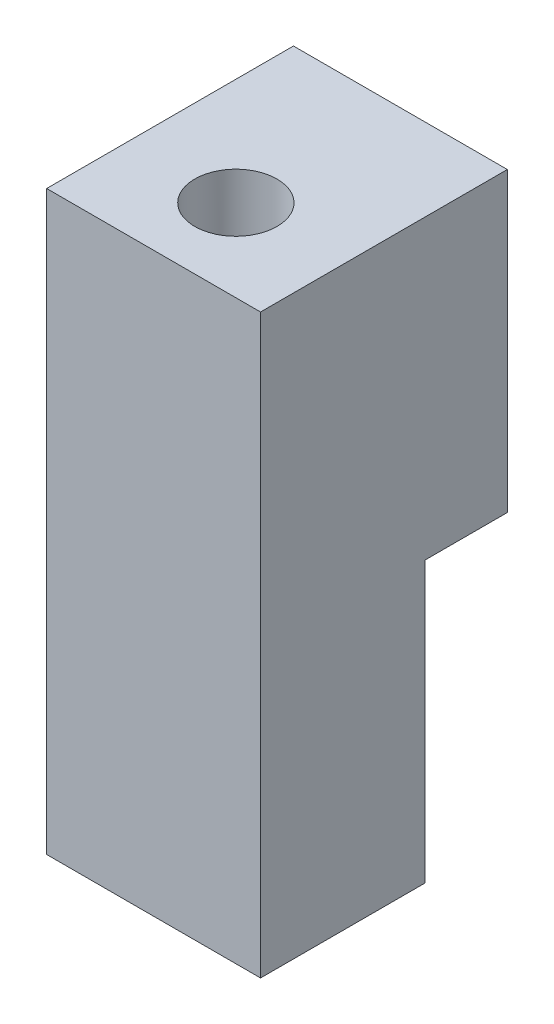
ISO-10303-21;
HEADER;
FILE_DESCRIPTION(('STEP AP214'),'2;1');
FILE_NAME('part.step','',(''),(''),'','','');
FILE_SCHEMA(('AUTOMOTIVE_DESIGN { 1 0 10303 214 1 1 1 1 }'));
ENDSEC;
DATA;
#1=APPLICATION_CONTEXT('core data for automotive mechanical design processes');
#2=APPLICATION_PROTOCOL_DEFINITION('international standard','automotive_design',2000,#1);
#3=PRODUCT_CONTEXT('',#1,'mechanical');
#4=PRODUCT('Part','Part','',(#3));
#5=PRODUCT_RELATED_PRODUCT_CATEGORY('part','',(#4));
#6=PRODUCT_DEFINITION_FORMATION('','',#4);
#7=PRODUCT_DEFINITION_CONTEXT('part definition',#1,'design');
#8=PRODUCT_DEFINITION('design','',#6,#7);
#9=PRODUCT_DEFINITION_SHAPE('','',#8);
#10=(LENGTH_UNIT() NAMED_UNIT(*) SI_UNIT(.MILLI.,.METRE.));
#11=(NAMED_UNIT(*) PLANE_ANGLE_UNIT() SI_UNIT($,.RADIAN.));
#12=(NAMED_UNIT(*) SI_UNIT($,.STERADIAN.) SOLID_ANGLE_UNIT());
#13=UNCERTAINTY_MEASURE_WITH_UNIT(LENGTH_MEASURE(1.E-05),#10,'distance_accuracy_value','');
#14=(GEOMETRIC_REPRESENTATION_CONTEXT(3) GLOBAL_UNCERTAINTY_ASSIGNED_CONTEXT((#13)) GLOBAL_UNIT_ASSIGNED_CONTEXT((#10,
#11,#12)) REPRESENTATION_CONTEXT('',''));
#15=CARTESIAN_POINT('',(0.,0.,0.));
#16=DIRECTION('',(0.,0.,1.));
#17=DIRECTION('',(1.,0.,0.));
#18=AXIS2_PLACEMENT_3D('',#15,#16,#17);
#19=CARTESIAN_POINT('',(125.75,35.,10.));
#20=DIRECTION('',(1.,0.,0.));
#21=DIRECTION('',(0.,0.,-1.));
#22=AXIS2_PLACEMENT_3D('',#19,#20,#21);
#23=PLANE('',#22);
#24=DIRECTION('',(0.,0.,-1.));
#25=VECTOR('',#24,1.);
#26=CARTESIAN_POINT('',(125.75,16.9444271909998,0.));
#27=LINE('',#26,#25);
#28=CARTESIAN_POINT('',(125.75,16.9444271909998,5.));
#29=VERTEX_POINT('',#28);
#30=CARTESIAN_POINT('',(125.75,16.9444271909998,0.));
#31=VERTEX_POINT('',#30);
#32=EDGE_CURVE('E64',#29,#31,#27,.T.);
#33=ORIENTED_EDGE('',*,*,#32,.F.);
#34=DIRECTION('',(0.,1.,0.));
#35=VECTOR('',#34,1.);
#36=CARTESIAN_POINT('',(125.75,-0.0555728090001692,5.));
#37=LINE('',#36,#35);
#38=CARTESIAN_POINT('',(125.75,-0.0555728090001692,5.));
#39=VERTEX_POINT('',#38);
#40=EDGE_CURVE('E291',#39,#29,#37,.T.);
#41=ORIENTED_EDGE('',*,*,#40,.F.);
#42=DIRECTION('',(0.,0.,-1.));
#43=VECTOR('',#42,1.);
#44=CARTESIAN_POINT('',(125.75,-0.0555728090001692,15.));
#45=LINE('',#44,#43);
#46=CARTESIAN_POINT('',(125.75,-0.0555728090001692,15.));
#47=VERTEX_POINT('',#46);
#48=EDGE_CURVE('E323',#47,#39,#45,.T.);
#49=ORIENTED_EDGE('',*,*,#48,.F.);
#50=DIRECTION('',(0.,1.,0.));
#51=VECTOR('',#50,1.);
#52=CARTESIAN_POINT('',(125.75,12.9444271909998,15.));
#53=LINE('',#52,#51);
#54=CARTESIAN_POINT('',(125.75,35.,15.));
#55=VERTEX_POINT('',#54);
#56=EDGE_CURVE('E218',#47,#55,#53,.T.);
#57=ORIENTED_EDGE('',*,*,#56,.T.);
#58=DIRECTION('',(0.,0.,-1.));
#59=VECTOR('',#58,1.);
#60=CARTESIAN_POINT('',(125.75,35.,10.));
#61=LINE('',#60,#59);
#62=CARTESIAN_POINT('',(125.75,35.,0.));
#63=VERTEX_POINT('',#62);
#64=EDGE_CURVE('E57',#55,#63,#61,.T.);
#65=ORIENTED_EDGE('',*,*,#64,.T.);
#66=DIRECTION('',(0.,-1.,0.));
#67=VECTOR('',#66,1.);
#68=CARTESIAN_POINT('',(125.75,35.,0.));
#69=LINE('',#68,#67);
#70=EDGE_CURVE('E211',#63,#31,#69,.T.);
#71=ORIENTED_EDGE('',*,*,#70,.T.);
#72=EDGE_LOOP('',(#33,#41,#49,#57,#65,#71));
#73=FACE_BOUND('',#72,.T.);
#74=ADVANCED_FACE('F49',(#73),#23,.F.);
#75=CARTESIAN_POINT('',(132.25,12.9444271909998,10.));
#76=DIRECTION('',(0.,0.,-1.));
#77=DIRECTION('',(-1.,0.,0.));
#78=AXIS2_PLACEMENT_3D('',#75,#76,#77);
#79=CYLINDRICAL_SURFACE('',#78,6.50000000000001);
#80=DIRECTION('',(0.,0.,-1.));
#81=VECTOR('',#80,1.);
#82=CARTESIAN_POINT('',(127.12652461702,16.9444271909998,10.));
#83=LINE('',#82,#81);
#84=CARTESIAN_POINT('',(127.12652461702,16.9444271909998,0.));
#85=VERTEX_POINT('',#84);
#86=CARTESIAN_POINT('',(127.12652461702,16.9444271909998,5.));
#87=VERTEX_POINT('',#86);
#88=EDGE_CURVE('E339',#85,#87,#83,.F.);
#89=ORIENTED_EDGE('',*,*,#88,.F.);
#90=CARTESIAN_POINT('',(132.25,12.9444271909998,0.));
#91=DIRECTION('',(0.,0.,-1.));
#92=DIRECTION('',(1.,0.,0.));
#93=AXIS2_PLACEMENT_3D('',#90,#91,#92);
#94=CIRCLE('',#93,6.50000000000001);
#95=CARTESIAN_POINT('',(137.37347538298,16.9444271909998,0.));
#96=VERTEX_POINT('',#95);
#97=EDGE_CURVE('E208',#85,#96,#94,.T.);
#98=ORIENTED_EDGE('',*,*,#97,.T.);
#99=DIRECTION('',(0.,0.,-1.));
#100=VECTOR('',#99,1.);
#101=CARTESIAN_POINT('',(137.37347538298,16.9444271909998,10.));
#102=LINE('',#101,#100);
#103=CARTESIAN_POINT('',(137.37347538298,16.9444271909998,5.));
#104=VERTEX_POINT('',#103);
#105=EDGE_CURVE('E71',#104,#96,#102,.T.);
#106=ORIENTED_EDGE('',*,*,#105,.F.);
#107=CARTESIAN_POINT('',(132.25,12.9444271909998,5.));
#108=DIRECTION('',(0.,0.,-1.));
#109=DIRECTION('',(-1.,0.,0.));
#110=AXIS2_PLACEMENT_3D('',#107,#108,#109);
#111=CIRCLE('',#110,6.50000000000001);
#112=EDGE_CURVE('E222',#104,#87,#111,.F.);
#113=ORIENTED_EDGE('',*,*,#112,.T.);
#114=EDGE_LOOP('',(#89,#98,#106,#113));
#115=FACE_BOUND('',#114,.T.);
#116=ADVANCED_FACE('F349',(#115),#79,.F.);
#117=CARTESIAN_POINT('',(138.75,12.9444271909998,10.));
#118=DIRECTION('',(-1.,0.,0.));
#119=DIRECTION('',(0.,0.,1.));
#120=AXIS2_PLACEMENT_3D('',#117,#118,#119);
#121=PLANE('',#120);
#122=DIRECTION('',(0.,1.,0.));
#123=VECTOR('',#122,1.);
#124=CARTESIAN_POINT('',(138.75,-0.0555728090001692,5.));
#125=LINE('',#124,#123);
#126=CARTESIAN_POINT('',(138.75,-0.0555728090001692,5.));
#127=VERTEX_POINT('',#126);
#128=CARTESIAN_POINT('',(138.75,16.9444271909998,5.));
#129=VERTEX_POINT('',#128);
#130=EDGE_CURVE('E197',#127,#129,#125,.T.);
#131=ORIENTED_EDGE('',*,*,#130,.T.);
#132=DIRECTION('',(0.,0.,-1.));
#133=VECTOR('',#132,1.);
#134=CARTESIAN_POINT('',(138.75,16.9444271909998,0.));
#135=LINE('',#134,#133);
#136=CARTESIAN_POINT('',(138.75,16.9444271909998,0.));
#137=VERTEX_POINT('',#136);
#138=EDGE_CURVE('E186',#129,#137,#135,.T.);
#139=ORIENTED_EDGE('',*,*,#138,.T.);
#140=DIRECTION('',(0.,1.,0.));
#141=VECTOR('',#140,1.);
#142=CARTESIAN_POINT('',(138.75,12.9444271909998,0.));
#143=LINE('',#142,#141);
#144=CARTESIAN_POINT('',(138.75,35.,0.));
#145=VERTEX_POINT('',#144);
#146=EDGE_CURVE('E193',#137,#145,#143,.T.);
#147=ORIENTED_EDGE('',*,*,#146,.T.);
#148=DIRECTION('',(0.,0.,-1.));
#149=VECTOR('',#148,1.);
#150=CARTESIAN_POINT('',(138.75,35.,10.));
#151=LINE('',#150,#149);
#152=CARTESIAN_POINT('',(138.75,35.,15.));
#153=VERTEX_POINT('',#152);
#154=EDGE_CURVE('E207',#153,#145,#151,.T.);
#155=ORIENTED_EDGE('',*,*,#154,.F.);
#156=DIRECTION('',(0.,1.,0.));
#157=VECTOR('',#156,1.);
#158=CARTESIAN_POINT('',(138.75,12.9444271909998,15.));
#159=LINE('',#158,#157);
#160=CARTESIAN_POINT('',(138.75,-0.0555728090001692,15.));
#161=VERTEX_POINT('',#160);
#162=EDGE_CURVE('E225',#161,#153,#159,.T.);
#163=ORIENTED_EDGE('',*,*,#162,.F.);
#164=DIRECTION('',(0.,0.,1.));
#165=VECTOR('',#164,1.);
#166=CARTESIAN_POINT('',(138.75,-0.0555728090001692,5.));
#167=LINE('',#166,#165);
#168=EDGE_CURVE('E328',#127,#161,#167,.T.);
#169=ORIENTED_EDGE('',*,*,#168,.F.);
#170=EDGE_LOOP('',(#131,#139,#147,#155,#163,#169));
#171=FACE_BOUND('',#170,.T.);
#172=ADVANCED_FACE('F192',(#171),#121,.F.);
#173=CARTESIAN_POINT('',(132.25,12.9444271909998,0.));
#174=DIRECTION('',(0.,0.,1.));
#175=DIRECTION('',(1.,0.,0.));
#176=AXIS2_PLACEMENT_3D('',#173,#174,#175);
#177=PLANE('',#176);
#178=DIRECTION('',(1.,0.,0.));
#179=VECTOR('',#178,1.);
#180=CARTESIAN_POINT('',(0.,16.9444271909998,0.));
#181=LINE('',#180,#179);
#182=EDGE_CURVE('E200',#31,#85,#181,.T.);
#183=ORIENTED_EDGE('',*,*,#182,.F.);
#184=ORIENTED_EDGE('',*,*,#70,.F.);
#185=DIRECTION('',(-1.,0.,0.));
#186=VECTOR('',#185,1.);
#187=CARTESIAN_POINT('',(138.75,35.,0.));
#188=LINE('',#187,#186);
#189=EDGE_CURVE('E206',#145,#63,#188,.T.);
#190=ORIENTED_EDGE('',*,*,#189,.F.);
#191=ORIENTED_EDGE('',*,*,#146,.F.);
#192=DIRECTION('',(1.,0.,0.));
#193=VECTOR('',#192,1.);
#194=CARTESIAN_POINT('',(132.25,16.9444271909998,0.));
#195=LINE('',#194,#193);
#196=EDGE_CURVE('E14',#96,#137,#195,.T.);
#197=ORIENTED_EDGE('',*,*,#196,.F.);
#198=ORIENTED_EDGE('',*,*,#97,.F.);
#199=EDGE_LOOP('',(#183,#184,#190,#191,#197,#198));
#200=FACE_BOUND('',#199,.T.);
#201=ADVANCED_FACE('F203',(#200),#177,.F.);
#202=CARTESIAN_POINT('',(132.25,35.9444271909998,10.));
#203=DIRECTION('',(0.,-1.,0.));
#204=DIRECTION('',(0.,0.,-1.));
#205=AXIS2_PLACEMENT_3D('',#202,#203,#204);
#206=CYLINDRICAL_SURFACE('',#205,2.5);
#207=CARTESIAN_POINT('',(132.25,35.,10.));
#208=DIRECTION('',(0.,-1.,0.));
#209=DIRECTION('',(0.,0.,-1.));
#210=AXIS2_PLACEMENT_3D('',#207,#208,#209);
#211=CIRCLE('',#210,2.5);
#212=CARTESIAN_POINT('',(132.25,35.,7.50000000000001));
#213=VERTEX_POINT('',#212);
#214=EDGE_CURVE('E233',#213,#213,#211,.T.);
#215=ORIENTED_EDGE('',*,*,#214,.F.);
#216=EDGE_LOOP('',(#215));
#217=FACE_BOUND('',#216,.T.);
#218=DIRECTION('',(0.,-1.,0.));
#219=VECTOR('',#218,1.);
#220=CARTESIAN_POINT('',(133.5,17.9444271909998,7.83493649053891));
#221=LINE('',#220,#219);
#222=CARTESIAN_POINT('',(133.5,17.9444271909998,7.83493649053891));
#223=VERTEX_POINT('',#222);
#224=CARTESIAN_POINT('',(133.5,-0.0555728090001692,7.83493649053891));
#225=VERTEX_POINT('',#224);
#226=EDGE_CURVE('E244',#223,#225,#221,.T.);
#227=ORIENTED_EDGE('',*,*,#226,.T.);
#228=CARTESIAN_POINT('',(132.25,-0.0555728090001692,10.));
#229=DIRECTION('',(0.,1.,0.));
#230=DIRECTION('',(0.,0.,-1.));
#231=AXIS2_PLACEMENT_3D('',#228,#229,#230);
#232=CIRCLE('',#231,2.5);
#233=CARTESIAN_POINT('',(134.25,-0.0555728090001692,8.49999999999999));
#234=VERTEX_POINT('',#233);
#235=EDGE_CURVE('E336',#234,#225,#232,.T.);
#236=ORIENTED_EDGE('',*,*,#235,.F.);
#237=DIRECTION('',(0.,-1.,0.));
#238=VECTOR('',#237,1.);
#239=CARTESIAN_POINT('',(134.25,39.2426406871193,8.49999999999999));
#240=LINE('',#239,#238);
#241=CARTESIAN_POINT('',(134.25,30.,8.5));
#242=VERTEX_POINT('',#241);
#243=EDGE_CURVE('E264',#242,#234,#240,.T.);
#244=ORIENTED_EDGE('',*,*,#243,.F.);
#245=CARTESIAN_POINT('',(132.25,30.,9.99999999999999));
#246=DIRECTION('',(0.,-1.,0.));
#247=DIRECTION('',(0.,0.,-1.));
#248=AXIS2_PLACEMENT_3D('',#245,#246,#247);
#249=CIRCLE('',#248,2.5);
#250=CARTESIAN_POINT('',(134.25,30.,11.5));
#251=VERTEX_POINT('',#250);
#252=EDGE_CURVE('E259',#242,#251,#249,.T.);
#253=ORIENTED_EDGE('',*,*,#252,.T.);
#254=DIRECTION('',(0.,-1.,0.));
#255=VECTOR('',#254,1.);
#256=CARTESIAN_POINT('',(134.25,39.2426406871193,11.5));
#257=LINE('',#256,#255);
#258=CARTESIAN_POINT('',(134.25,-0.0555728090001692,11.5));
#259=VERTEX_POINT('',#258);
#260=EDGE_CURVE('E262',#251,#259,#257,.T.);
#261=ORIENTED_EDGE('',*,*,#260,.T.);
#262=CARTESIAN_POINT('',(132.25,-0.0555728090001692,10.));
#263=DIRECTION('',(0.,1.,0.));
#264=DIRECTION('',(0.,0.,-1.));
#265=AXIS2_PLACEMENT_3D('',#262,#263,#264);
#266=CIRCLE('',#265,2.5);
#267=CARTESIAN_POINT('',(130.25,-0.0555728090001692,11.5));
#268=VERTEX_POINT('',#267);
#269=EDGE_CURVE('E302',#268,#259,#266,.T.);
#270=ORIENTED_EDGE('',*,*,#269,.F.);
#271=DIRECTION('',(0.,-1.,0.));
#272=VECTOR('',#271,1.);
#273=CARTESIAN_POINT('',(130.25,39.2426406871193,11.5));
#274=LINE('',#273,#272);
#275=CARTESIAN_POINT('',(130.25,30.,11.5));
#276=VERTEX_POINT('',#275);
#277=EDGE_CURVE('E248',#276,#268,#274,.T.);
#278=ORIENTED_EDGE('',*,*,#277,.F.);
#279=CARTESIAN_POINT('',(132.25,30.,9.99999999999999));
#280=DIRECTION('',(0.,-1.,0.));
#281=DIRECTION('',(0.,0.,-1.));
#282=AXIS2_PLACEMENT_3D('',#279,#280,#281);
#283=CIRCLE('',#282,2.5);
#284=CARTESIAN_POINT('',(130.25,30.,8.5));
#285=VERTEX_POINT('',#284);
#286=EDGE_CURVE('E253',#276,#285,#283,.T.);
#287=ORIENTED_EDGE('',*,*,#286,.T.);
#288=DIRECTION('',(0.,-1.,0.));
#289=VECTOR('',#288,1.);
#290=CARTESIAN_POINT('',(130.25,39.2426406871193,8.49999999999999));
#291=LINE('',#290,#289);
#292=CARTESIAN_POINT('',(130.25,-0.0555728090001692,8.5));
#293=VERTEX_POINT('',#292);
#294=EDGE_CURVE('E246',#285,#293,#291,.T.);
#295=ORIENTED_EDGE('',*,*,#294,.T.);
#296=CARTESIAN_POINT('',(132.25,-0.0555728090001692,10.));
#297=DIRECTION('',(0.,1.,0.));
#298=DIRECTION('',(0.,0.,-1.));
#299=AXIS2_PLACEMENT_3D('',#296,#297,#298);
#300=CIRCLE('',#299,2.5);
#301=CARTESIAN_POINT('',(131.,-0.0555728090001692,7.83493649053891));
#302=VERTEX_POINT('',#301);
#303=EDGE_CURVE('E314',#302,#293,#300,.T.);
#304=ORIENTED_EDGE('',*,*,#303,.F.);
#305=DIRECTION('',(0.,-1.,0.));
#306=VECTOR('',#305,1.);
#307=CARTESIAN_POINT('',(131.,17.9444271909998,7.83493649053891));
#308=LINE('',#307,#306);
#309=CARTESIAN_POINT('',(131.,17.9444271909998,7.83493649053891));
#310=VERTEX_POINT('',#309);
#311=EDGE_CURVE('E273',#310,#302,#308,.T.);
#312=ORIENTED_EDGE('',*,*,#311,.F.);
#313=CARTESIAN_POINT('',(132.25,17.9444271909998,10.));
#314=DIRECTION('',(0.,-1.,0.));
#315=DIRECTION('',(0.,0.,-1.));
#316=AXIS2_PLACEMENT_3D('',#313,#314,#315);
#317=CIRCLE('',#316,2.5);
#318=EDGE_CURVE('E287',#223,#310,#317,.F.);
#319=ORIENTED_EDGE('',*,*,#318,.F.);
#320=EDGE_LOOP('',(#227,#236,#244,#253,#261,#270,#278,#287,#295,#304,#312,#319));
#321=FACE_BOUND('',#320,.T.);
#322=ADVANCED_FACE('F366',(#217,#321),#206,.F.);
#323=CARTESIAN_POINT('',(0.,12.9444271909998,5.));
#324=DIRECTION('',(0.,0.,-1.));
#325=DIRECTION('',(-1.,0.,0.));
#326=AXIS2_PLACEMENT_3D('',#323,#324,#325);
#327=PLANE('',#326);
#328=DIRECTION('',(1.,0.,0.));
#329=VECTOR('',#328,1.);
#330=CARTESIAN_POINT('',(0.,16.9444271909998,5.));
#331=LINE('',#330,#329);
#332=EDGE_CURVE('E342',#29,#87,#331,.T.);
#333=ORIENTED_EDGE('',*,*,#332,.T.);
#334=ORIENTED_EDGE('',*,*,#112,.F.);
#335=EDGE_CURVE('E199',#104,#129,#331,.T.);
#336=ORIENTED_EDGE('',*,*,#335,.T.);
#337=ORIENTED_EDGE('',*,*,#130,.F.);
#338=DIRECTION('',(1.,0.,0.));
#339=VECTOR('',#338,1.);
#340=CARTESIAN_POINT('',(133.5,-0.0555728090001692,5.));
#341=LINE('',#340,#339);
#342=CARTESIAN_POINT('',(133.5,-0.0555728090001692,5.));
#343=VERTEX_POINT('',#342);
#344=EDGE_CURVE('E331',#343,#127,#341,.T.);
#345=ORIENTED_EDGE('',*,*,#344,.F.);
#346=DIRECTION('',(0.,-1.,0.));
#347=VECTOR('',#346,1.);
#348=CARTESIAN_POINT('',(133.5,17.9444271909998,5.));
#349=LINE('',#348,#347);
#350=CARTESIAN_POINT('',(133.5,17.9444271909998,5.));
#351=VERTEX_POINT('',#350);
#352=EDGE_CURVE('E278',#351,#343,#349,.T.);
#353=ORIENTED_EDGE('',*,*,#352,.F.);
#354=DIRECTION('',(1.,0.,0.));
#355=VECTOR('',#354,1.);
#356=CARTESIAN_POINT('',(0.,17.9444271909998,5.));
#357=LINE('',#356,#355);
#358=CARTESIAN_POINT('',(131.,17.9444271909998,5.));
#359=VERTEX_POINT('',#358);
#360=EDGE_CURVE('E282',#359,#351,#357,.T.);
#361=ORIENTED_EDGE('',*,*,#360,.F.);
#362=DIRECTION('',(0.,-1.,0.));
#363=VECTOR('',#362,1.);
#364=CARTESIAN_POINT('',(131.,17.9444271909998,5.));
#365=LINE('',#364,#363);
#366=CARTESIAN_POINT('',(131.,-0.0555728090001692,5.));
#367=VERTEX_POINT('',#366);
#368=EDGE_CURVE('E275',#359,#367,#365,.T.);
#369=ORIENTED_EDGE('',*,*,#368,.T.);
#370=DIRECTION('',(1.,0.,0.));
#371=VECTOR('',#370,1.);
#372=CARTESIAN_POINT('',(125.75,-0.0555728090001692,5.));
#373=LINE('',#372,#371);
#374=EDGE_CURVE('E320',#39,#367,#373,.T.);
#375=ORIENTED_EDGE('',*,*,#374,.F.);
#376=ORIENTED_EDGE('',*,*,#40,.T.);
#377=EDGE_LOOP('',(#333,#334,#336,#337,#345,#353,#361,#369,#375,#376));
#378=FACE_BOUND('',#377,.T.);
#379=ADVANCED_FACE('F352',(#378),#327,.T.);
#380=CARTESIAN_POINT('',(138.75,35.,10.));
#381=DIRECTION('',(0.,-1.,0.));
#382=DIRECTION('',(0.,0.,-1.));
#383=AXIS2_PLACEMENT_3D('',#380,#381,#382);
#384=PLANE('',#383);
#385=ORIENTED_EDGE('',*,*,#214,.T.);
#386=EDGE_LOOP('',(#385));
#387=FACE_BOUND('',#386,.T.);
#388=ORIENTED_EDGE('',*,*,#189,.T.);
#389=ORIENTED_EDGE('',*,*,#64,.F.);
#390=DIRECTION('',(1.,0.,0.));
#391=VECTOR('',#390,1.);
#392=CARTESIAN_POINT('',(138.75,35.,15.));
#393=LINE('',#392,#391);
#394=EDGE_CURVE('E229',#55,#153,#393,.T.);
#395=ORIENTED_EDGE('',*,*,#394,.T.);
#396=ORIENTED_EDGE('',*,*,#154,.T.);
#397=EDGE_LOOP('',(#388,#389,#395,#396));
#398=FACE_BOUND('',#397,.T.);
#399=ADVANCED_FACE('F51',(#387,#398),#384,.F.);
#400=CARTESIAN_POINT('',(138.75,12.9444271909998,15.));
#401=DIRECTION('',(0.,0.,1.));
#402=DIRECTION('',(1.,0.,0.));
#403=AXIS2_PLACEMENT_3D('',#400,#401,#402);
#404=PLANE('',#403);
#405=ORIENTED_EDGE('',*,*,#394,.F.);
#406=ORIENTED_EDGE('',*,*,#56,.F.);
#407=DIRECTION('',(-1.,0.,0.));
#408=VECTOR('',#407,1.);
#409=CARTESIAN_POINT('',(138.75,-0.0555728090001692,15.));
#410=LINE('',#409,#408);
#411=EDGE_CURVE('E325',#161,#47,#410,.T.);
#412=ORIENTED_EDGE('',*,*,#411,.F.);
#413=ORIENTED_EDGE('',*,*,#162,.T.);
#414=EDGE_LOOP('',(#405,#406,#412,#413));
#415=FACE_BOUND('',#414,.T.);
#416=ADVANCED_FACE('F409',(#415),#404,.T.);
#417=CARTESIAN_POINT('',(0.,39.2426406871193,11.5));
#418=DIRECTION('',(0.,0.,-1.));
#419=DIRECTION('',(-1.,0.,0.));
#420=AXIS2_PLACEMENT_3D('',#417,#418,#419);
#421=PLANE('',#420);
#422=ORIENTED_EDGE('',*,*,#277,.T.);
#423=DIRECTION('',(1.,0.,0.));
#424=VECTOR('',#423,1.);
#425=CARTESIAN_POINT('',(127.25,-0.0555728090001692,11.5));
#426=LINE('',#425,#424);
#427=CARTESIAN_POINT('',(127.25,-0.0555728090001692,11.5));
#428=VERTEX_POINT('',#427);
#429=EDGE_CURVE('E305',#428,#268,#426,.T.);
#430=ORIENTED_EDGE('',*,*,#429,.F.);
#431=DIRECTION('',(0.,-1.,0.));
#432=VECTOR('',#431,1.);
#433=CARTESIAN_POINT('',(127.25,39.2426406871193,11.5));
#434=LINE('',#433,#432);
#435=CARTESIAN_POINT('',(127.25,30.,11.5));
#436=VERTEX_POINT('',#435);
#437=EDGE_CURVE('E241',#436,#428,#434,.T.);
#438=ORIENTED_EDGE('',*,*,#437,.F.);
#439=DIRECTION('',(-1.,0.,0.));
#440=VECTOR('',#439,1.);
#441=CARTESIAN_POINT('',(0.,30.,11.5));
#442=LINE('',#441,#440);
#443=EDGE_CURVE('E240',#276,#436,#442,.T.);
#444=ORIENTED_EDGE('',*,*,#443,.F.);
#445=EDGE_LOOP('',(#422,#430,#438,#444));
#446=FACE_BOUND('',#445,.T.);
#447=ADVANCED_FACE('F383',(#446),#421,.T.);
#448=CARTESIAN_POINT('',(0.,39.2426406871193,8.49999999999999));
#449=DIRECTION('',(0.,0.,-1.));
#450=DIRECTION('',(-1.,0.,0.));
#451=AXIS2_PLACEMENT_3D('',#448,#449,#450);
#452=PLANE('',#451);
#453=DIRECTION('',(-1.,0.,0.));
#454=VECTOR('',#453,1.);
#455=CARTESIAN_POINT('',(0.,30.,8.49999999999999));
#456=LINE('',#455,#454);
#457=CARTESIAN_POINT('',(127.25,30.,8.49999999999999));
#458=VERTEX_POINT('',#457);
#459=EDGE_CURVE('E250',#285,#458,#456,.T.);
#460=ORIENTED_EDGE('',*,*,#459,.T.);
#461=DIRECTION('',(0.,-1.,0.));
#462=VECTOR('',#461,1.);
#463=CARTESIAN_POINT('',(127.25,39.2426406871193,8.49999999999999));
#464=LINE('',#463,#462);
#465=CARTESIAN_POINT('',(127.25,-0.0555728090001692,8.49999999999999));
#466=VERTEX_POINT('',#465);
#467=EDGE_CURVE('E243',#458,#466,#464,.T.);
#468=ORIENTED_EDGE('',*,*,#467,.T.);
#469=DIRECTION('',(-1.,0.,0.));
#470=VECTOR('',#469,1.);
#471=CARTESIAN_POINT('',(130.25,-0.0555728090001692,8.5));
#472=LINE('',#471,#470);
#473=EDGE_CURVE('E311',#293,#466,#472,.T.);
#474=ORIENTED_EDGE('',*,*,#473,.F.);
#475=ORIENTED_EDGE('',*,*,#294,.F.);
#476=EDGE_LOOP('',(#460,#468,#474,#475));
#477=FACE_BOUND('',#476,.T.);
#478=ADVANCED_FACE('F370',(#477),#452,.F.);
#479=CARTESIAN_POINT('',(127.25,39.2426406871193,0.));
#480=DIRECTION('',(-1.,0.,0.));
#481=DIRECTION('',(0.,0.,1.));
#482=AXIS2_PLACEMENT_3D('',#479,#480,#481);
#483=PLANE('',#482);
#484=DIRECTION('',(0.,0.,1.));
#485=VECTOR('',#484,1.);
#486=CARTESIAN_POINT('',(127.25,30.,0.));
#487=LINE('',#486,#485);
#488=EDGE_CURVE('E237',#458,#436,#487,.T.);
#489=ORIENTED_EDGE('',*,*,#488,.T.);
#490=ORIENTED_EDGE('',*,*,#437,.T.);
#491=DIRECTION('',(0.,0.,1.));
#492=VECTOR('',#491,1.);
#493=CARTESIAN_POINT('',(127.25,-0.0555728090001692,8.49999999999999));
#494=LINE('',#493,#492);
#495=EDGE_CURVE('E308',#466,#428,#494,.T.);
#496=ORIENTED_EDGE('',*,*,#495,.F.);
#497=ORIENTED_EDGE('',*,*,#467,.F.);
#498=EDGE_LOOP('',(#489,#490,#496,#497));
#499=FACE_BOUND('',#498,.T.);
#500=ADVANCED_FACE('F375',(#499),#483,.F.);
#501=CARTESIAN_POINT('',(138.75,30.,10.));
#502=DIRECTION('',(0.,-1.,0.));
#503=DIRECTION('',(0.,0.,-1.));
#504=AXIS2_PLACEMENT_3D('',#501,#502,#503);
#505=PLANE('',#504);
#506=ORIENTED_EDGE('',*,*,#286,.F.);
#507=ORIENTED_EDGE('',*,*,#443,.T.);
#508=ORIENTED_EDGE('',*,*,#488,.F.);
#509=ORIENTED_EDGE('',*,*,#459,.F.);
#510=EDGE_LOOP('',(#506,#507,#508,#509));
#511=FACE_BOUND('',#510,.T.);
#512=ADVANCED_FACE('F378',(#511),#505,.T.);
#513=CARTESIAN_POINT('',(0.,39.2426406871193,11.5));
#514=DIRECTION('',(0.,0.,-1.));
#515=DIRECTION('',(-1.,0.,0.));
#516=AXIS2_PLACEMENT_3D('',#513,#514,#515);
#517=PLANE('',#516);
#518=DIRECTION('',(0.,-1.,0.));
#519=VECTOR('',#518,1.);
#520=CARTESIAN_POINT('',(137.25,39.2426406871193,11.5));
#521=LINE('',#520,#519);
#522=CARTESIAN_POINT('',(137.25,30.,11.5));
#523=VERTEX_POINT('',#522);
#524=CARTESIAN_POINT('',(137.25,-0.0555728090001692,11.5));
#525=VERTEX_POINT('',#524);
#526=EDGE_CURVE('E239',#523,#525,#521,.T.);
#527=ORIENTED_EDGE('',*,*,#526,.T.);
#528=DIRECTION('',(1.,0.,0.));
#529=VECTOR('',#528,1.);
#530=CARTESIAN_POINT('',(134.25,-0.0555728090001692,11.5));
#531=LINE('',#530,#529);
#532=EDGE_CURVE('E299',#259,#525,#531,.T.);
#533=ORIENTED_EDGE('',*,*,#532,.F.);
#534=ORIENTED_EDGE('',*,*,#260,.F.);
#535=DIRECTION('',(-1.,0.,0.));
#536=VECTOR('',#535,1.);
#537=CARTESIAN_POINT('',(0.,30.,11.5));
#538=LINE('',#537,#536);
#539=EDGE_CURVE('E257',#523,#251,#538,.T.);
#540=ORIENTED_EDGE('',*,*,#539,.F.);
#541=EDGE_LOOP('',(#527,#533,#534,#540));
#542=FACE_BOUND('',#541,.T.);
#543=ADVANCED_FACE('F390',(#542),#517,.T.);
#544=CARTESIAN_POINT('',(0.,39.2426406871193,8.49999999999999));
#545=DIRECTION('',(0.,0.,-1.));
#546=DIRECTION('',(-1.,0.,0.));
#547=AXIS2_PLACEMENT_3D('',#544,#545,#546);
#548=PLANE('',#547);
#549=DIRECTION('',(-1.,0.,0.));
#550=VECTOR('',#549,1.);
#551=CARTESIAN_POINT('',(0.,30.,8.49999999999999));
#552=LINE('',#551,#550);
#553=CARTESIAN_POINT('',(137.25,30.,8.49999999999999));
#554=VERTEX_POINT('',#553);
#555=EDGE_CURVE('E269',#554,#242,#552,.T.);
#556=ORIENTED_EDGE('',*,*,#555,.T.);
#557=ORIENTED_EDGE('',*,*,#243,.T.);
#558=DIRECTION('',(-1.,0.,0.));
#559=VECTOR('',#558,1.);
#560=CARTESIAN_POINT('',(137.25,-0.0555728090001692,8.49999999999999));
#561=LINE('',#560,#559);
#562=CARTESIAN_POINT('',(137.25,-0.0555728090001692,8.49999999999999));
#563=VERTEX_POINT('',#562);
#564=EDGE_CURVE('E293',#563,#234,#561,.T.);
#565=ORIENTED_EDGE('',*,*,#564,.F.);
#566=DIRECTION('',(0.,-1.,0.));
#567=VECTOR('',#566,1.);
#568=CARTESIAN_POINT('',(137.25,39.2426406871193,8.49999999999999));
#569=LINE('',#568,#567);
#570=EDGE_CURVE('E260',#554,#563,#569,.T.);
#571=ORIENTED_EDGE('',*,*,#570,.F.);
#572=EDGE_LOOP('',(#556,#557,#565,#571));
#573=FACE_BOUND('',#572,.T.);
#574=ADVANCED_FACE('F399',(#573),#548,.F.);
#575=CARTESIAN_POINT('',(137.25,39.2426406871193,0.));
#576=DIRECTION('',(-1.,0.,0.));
#577=DIRECTION('',(0.,0.,1.));
#578=AXIS2_PLACEMENT_3D('',#575,#576,#577);
#579=PLANE('',#578);
#580=ORIENTED_EDGE('',*,*,#570,.T.);
#581=DIRECTION('',(0.,0.,-1.));
#582=VECTOR('',#581,1.);
#583=CARTESIAN_POINT('',(137.25,-0.0555728090001692,11.5));
#584=LINE('',#583,#582);
#585=EDGE_CURVE('E296',#525,#563,#584,.T.);
#586=ORIENTED_EDGE('',*,*,#585,.F.);
#587=ORIENTED_EDGE('',*,*,#526,.F.);
#588=DIRECTION('',(0.,0.,1.));
#589=VECTOR('',#588,1.);
#590=CARTESIAN_POINT('',(137.25,30.,0.));
#591=LINE('',#590,#589);
#592=EDGE_CURVE('E236',#554,#523,#591,.T.);
#593=ORIENTED_EDGE('',*,*,#592,.F.);
#594=EDGE_LOOP('',(#580,#586,#587,#593));
#595=FACE_BOUND('',#594,.T.);
#596=ADVANCED_FACE('F395',(#595),#579,.T.);
#597=CARTESIAN_POINT('',(138.75,30.,10.));
#598=DIRECTION('',(0.,-1.,0.));
#599=DIRECTION('',(0.,0.,-1.));
#600=AXIS2_PLACEMENT_3D('',#597,#598,#599);
#601=PLANE('',#600);
#602=ORIENTED_EDGE('',*,*,#555,.F.);
#603=ORIENTED_EDGE('',*,*,#592,.T.);
#604=ORIENTED_EDGE('',*,*,#539,.T.);
#605=ORIENTED_EDGE('',*,*,#252,.F.);
#606=EDGE_LOOP('',(#602,#603,#604,#605));
#607=FACE_BOUND('',#606,.T.);
#608=ADVANCED_FACE('F401',(#607),#601,.T.);
#609=CARTESIAN_POINT('',(133.5,17.9444271909998,0.));
#610=DIRECTION('',(-1.,0.,0.));
#611=DIRECTION('',(0.,0.,1.));
#612=AXIS2_PLACEMENT_3D('',#609,#610,#611);
#613=PLANE('',#612);
#614=ORIENTED_EDGE('',*,*,#352,.T.);
#615=DIRECTION('',(0.,0.,-1.));
#616=VECTOR('',#615,1.);
#617=CARTESIAN_POINT('',(133.5,-0.0555728090001692,7.83493649053891));
#618=LINE('',#617,#616);
#619=EDGE_CURVE('E333',#225,#343,#618,.T.);
#620=ORIENTED_EDGE('',*,*,#619,.F.);
#621=ORIENTED_EDGE('',*,*,#226,.F.);
#622=DIRECTION('',(0.,0.,-1.));
#623=VECTOR('',#622,1.);
#624=CARTESIAN_POINT('',(133.5,17.9444271909998,0.));
#625=LINE('',#624,#623);
#626=EDGE_CURVE('E276',#223,#351,#625,.T.);
#627=ORIENTED_EDGE('',*,*,#626,.T.);
#628=EDGE_LOOP('',(#614,#620,#621,#627));
#629=FACE_BOUND('',#628,.T.);
#630=ADVANCED_FACE('F452',(#629),#613,.T.);
#631=CARTESIAN_POINT('',(131.,17.9444271909998,0.));
#632=DIRECTION('',(-1.,0.,0.));
#633=DIRECTION('',(0.,0.,1.));
#634=AXIS2_PLACEMENT_3D('',#631,#632,#633);
#635=PLANE('',#634);
#636=ORIENTED_EDGE('',*,*,#311,.T.);
#637=DIRECTION('',(0.,0.,1.));
#638=VECTOR('',#637,1.);
#639=CARTESIAN_POINT('',(131.,-0.0555728090001692,5.));
#640=LINE('',#639,#638);
#641=EDGE_CURVE('E317',#367,#302,#640,.T.);
#642=ORIENTED_EDGE('',*,*,#641,.F.);
#643=ORIENTED_EDGE('',*,*,#368,.F.);
#644=DIRECTION('',(0.,0.,-1.));
#645=VECTOR('',#644,1.);
#646=CARTESIAN_POINT('',(131.,17.9444271909998,0.));
#647=LINE('',#646,#645);
#648=EDGE_CURVE('E285',#310,#359,#647,.T.);
#649=ORIENTED_EDGE('',*,*,#648,.F.);
#650=EDGE_LOOP('',(#636,#642,#643,#649));
#651=FACE_BOUND('',#650,.T.);
#652=ADVANCED_FACE('F362',(#651),#635,.F.);
#653=CARTESIAN_POINT('',(0.,17.9444271909998,0.));
#654=DIRECTION('',(0.,-1.,0.));
#655=DIRECTION('',(0.,0.,-1.));
#656=AXIS2_PLACEMENT_3D('',#653,#654,#655);
#657=PLANE('',#656);
#658=ORIENTED_EDGE('',*,*,#318,.T.);
#659=ORIENTED_EDGE('',*,*,#648,.T.);
#660=ORIENTED_EDGE('',*,*,#360,.T.);
#661=ORIENTED_EDGE('',*,*,#626,.F.);
#662=EDGE_LOOP('',(#658,#659,#660,#661));
#663=FACE_BOUND('',#662,.T.);
#664=ADVANCED_FACE('F455',(#663),#657,.T.);
#665=CARTESIAN_POINT('',(132.25,-0.0555728090001692,10.));
#666=DIRECTION('',(0.,-1.,0.));
#667=DIRECTION('',(0.,0.,-1.));
#668=AXIS2_PLACEMENT_3D('',#665,#666,#667);
#669=PLANE('',#668);
#670=ORIENTED_EDGE('',*,*,#235,.T.);
#671=ORIENTED_EDGE('',*,*,#619,.T.);
#672=ORIENTED_EDGE('',*,*,#344,.T.);
#673=ORIENTED_EDGE('',*,*,#168,.T.);
#674=ORIENTED_EDGE('',*,*,#411,.T.);
#675=ORIENTED_EDGE('',*,*,#48,.T.);
#676=ORIENTED_EDGE('',*,*,#374,.T.);
#677=ORIENTED_EDGE('',*,*,#641,.T.);
#678=ORIENTED_EDGE('',*,*,#303,.T.);
#679=ORIENTED_EDGE('',*,*,#473,.T.);
#680=ORIENTED_EDGE('',*,*,#495,.T.);
#681=ORIENTED_EDGE('',*,*,#429,.T.);
#682=ORIENTED_EDGE('',*,*,#269,.T.);
#683=ORIENTED_EDGE('',*,*,#532,.T.);
#684=ORIENTED_EDGE('',*,*,#585,.T.);
#685=ORIENTED_EDGE('',*,*,#564,.T.);
#686=EDGE_LOOP('',(#670,#671,#672,#673,#674,#675,#676,#677,#678,#679,#680,#681,#682,#683,#684,#685));
#687=FACE_BOUND('',#686,.T.);
#688=ADVANCED_FACE('F359',(#687),#669,.T.);
#689=CARTESIAN_POINT('',(0.,16.9444271909998,0.));
#690=DIRECTION('',(0.,-1.,0.));
#691=DIRECTION('',(0.,0.,-1.));
#692=AXIS2_PLACEMENT_3D('',#689,#690,#691);
#693=PLANE('',#692);
#694=ORIENTED_EDGE('',*,*,#105,.T.);
#695=ORIENTED_EDGE('',*,*,#196,.T.);
#696=ORIENTED_EDGE('',*,*,#138,.F.);
#697=ORIENTED_EDGE('',*,*,#335,.F.);
#698=EDGE_LOOP('',(#694,#695,#696,#697));
#699=FACE_BOUND('',#698,.T.);
#700=ADVANCED_FACE('F185',(#699),#693,.T.);
#701=ORIENTED_EDGE('',*,*,#88,.T.);
#702=ORIENTED_EDGE('',*,*,#332,.F.);
#703=ORIENTED_EDGE('',*,*,#32,.T.);
#704=ORIENTED_EDGE('',*,*,#182,.T.);
#705=EDGE_LOOP('',(#701,#702,#703,#704));
#706=FACE_BOUND('',#705,.T.);
#707=ADVANCED_FACE('F347',(#706),#693,.T.);
#708=CLOSED_SHELL('',(#74,#116,#172,#201,#322,#379,#399,#416,#447,#478,#500,#512,#543,#574,#596,
#608,#630,#652,#664,#688,#700,#707));
#709=MANIFOLD_SOLID_BREP('B2',#708);
#710=ADVANCED_BREP_SHAPE_REPRESENTATION('',(#18,#709),#14);
#711=SHAPE_DEFINITION_REPRESENTATION(#9,#710);
ENDSEC;
END-ISO-10303-21;
